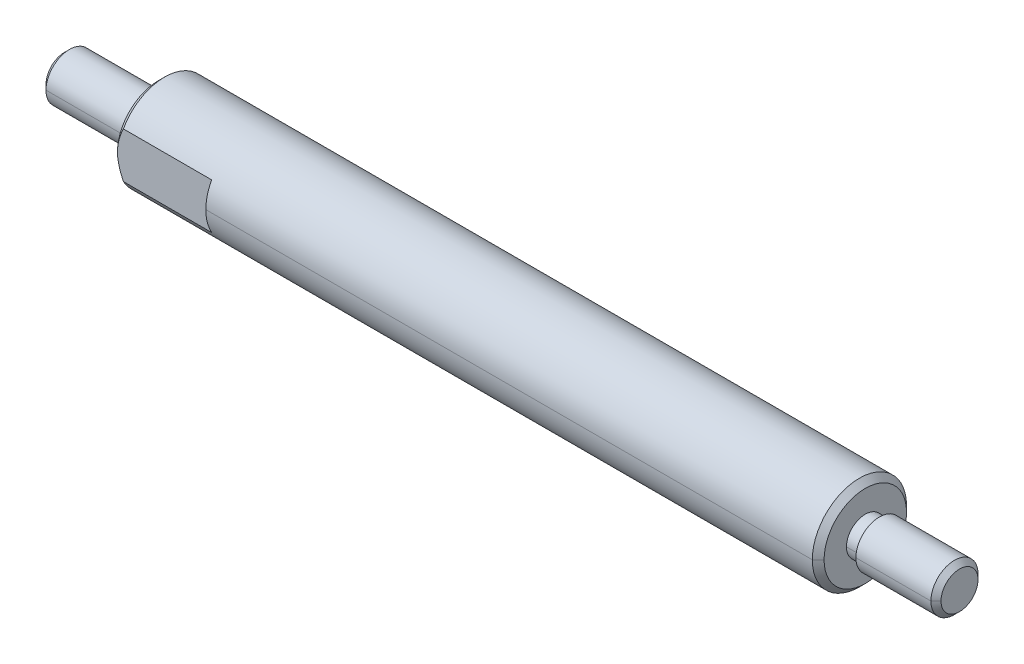
ISO-10303-21;
HEADER;
FILE_DESCRIPTION(('STEP AP214'),'2;1');
FILE_NAME('part.step','',(''),(''),'','','');
FILE_SCHEMA(('AUTOMOTIVE_DESIGN { 1 0 10303 214 1 1 1 1 }'));
ENDSEC;
DATA;
#1=APPLICATION_CONTEXT('core data for automotive mechanical design processes');
#2=APPLICATION_PROTOCOL_DEFINITION('international standard','automotive_design',2000,#1);
#3=PRODUCT_CONTEXT('',#1,'mechanical');
#4=PRODUCT('Part','Part','',(#3));
#5=PRODUCT_RELATED_PRODUCT_CATEGORY('part','',(#4));
#6=PRODUCT_DEFINITION_FORMATION('','',#4);
#7=PRODUCT_DEFINITION_CONTEXT('part definition',#1,'design');
#8=PRODUCT_DEFINITION('design','',#6,#7);
#9=PRODUCT_DEFINITION_SHAPE('','',#8);
#10=(LENGTH_UNIT() NAMED_UNIT(*) SI_UNIT(.MILLI.,.METRE.));
#11=(NAMED_UNIT(*) PLANE_ANGLE_UNIT() SI_UNIT($,.RADIAN.));
#12=(NAMED_UNIT(*) SI_UNIT($,.STERADIAN.) SOLID_ANGLE_UNIT());
#13=UNCERTAINTY_MEASURE_WITH_UNIT(LENGTH_MEASURE(1.E-05),#10,'distance_accuracy_value','');
#14=(GEOMETRIC_REPRESENTATION_CONTEXT(3) GLOBAL_UNCERTAINTY_ASSIGNED_CONTEXT((#13)) GLOBAL_UNIT_ASSIGNED_CONTEXT((#10,
#11,#12)) REPRESENTATION_CONTEXT('',''));
#15=CARTESIAN_POINT('',(0.,0.,0.));
#16=DIRECTION('',(0.,0.,1.));
#17=DIRECTION('',(1.,0.,0.));
#18=AXIS2_PLACEMENT_3D('',#15,#16,#17);
#19=CARTESIAN_POINT('',(0.,0.,0.));
#20=DIRECTION('',(1.,0.,0.));
#21=DIRECTION('',(0.,1.,0.));
#22=AXIS2_PLACEMENT_3D('',#19,#20,#21);
#23=CONICAL_SURFACE('',#22,3.5,0.785398163397448);
#24=CARTESIAN_POINT('',(0.5,0.,0.));
#25=DIRECTION('',(1.,0.,0.));
#26=DIRECTION('',(0.,0.,-1.));
#27=AXIS2_PLACEMENT_3D('',#24,#25,#26);
#28=CIRCLE('',#27,4.);
#29=CARTESIAN_POINT('',(0.5,-1.93649167310371,3.5));
#30=VERTEX_POINT('',#29);
#31=CARTESIAN_POINT('',(0.5,-1.93649167310371,-3.5));
#32=VERTEX_POINT('',#31);
#33=EDGE_CURVE('E11',#30,#32,#28,.T.);
#34=ORIENTED_EDGE('',*,*,#33,.F.);
#35=CARTESIAN_POINT('',(0.500000000000001,-1.93649167310371,3.5));
#36=CARTESIAN_POINT('',(0.481729894212885,-1.89874822282279,3.50000263641592));
#37=CARTESIAN_POINT('',(0.463809391218073,-1.86083494279448,3.50003144984892));
#38=CARTESIAN_POINT('',(0.428586511491032,-1.78442732561673,3.50010970070772));
#39=CARTESIAN_POINT('',(0.411288837618172,-1.74593082118933,3.50015926925334));
#40=CARTESIAN_POINT('',(0.377404980850407,-1.66846064543187,3.50024659944888));
#41=CARTESIAN_POINT('',(0.3608215799416,-1.62948575606787,3.50028431800336));
#42=CARTESIAN_POINT('',(0.328462664813169,-1.55115235623506,3.50033232603049));
#43=CARTESIAN_POINT('',(0.312688042674488,-1.51179347683754,3.50034258582854));
#44=CARTESIAN_POINT('',(0.282042244040601,-1.4327756106038,3.50033174018014));
#45=CARTESIAN_POINT('',(0.267170078584431,-1.3931170078691,3.5003106697376));
#46=CARTESIAN_POINT('',(0.238425065228237,-1.3135718201573,3.50024602692636));
#47=CARTESIAN_POINT('',(0.224549380422823,-1.27368626217215,3.50020252157718));
#48=CARTESIAN_POINT('',(0.197892794870912,-1.19374729444133,3.50011315115411));
#49=CARTESIAN_POINT('',(0.185107299963627,-1.15369541993336,3.50006729743444));
#50=CARTESIAN_POINT('',(0.16072263153736,-1.0734537181225,3.5000058547852));
#51=CARTESIAN_POINT('',(0.149117749799592,-1.03326563123095,3.49999011296507));
#52=CARTESIAN_POINT('',(0.127119094234048,-0.952520739957388,3.50002953689601));
#53=CARTESIAN_POINT('',(0.116726397725898,-0.911963641606916,3.50008476520527));
#54=CARTESIAN_POINT('',(0.0971615752584517,-0.830472191873705,3.50020787581652));
#55=CARTESIAN_POINT('',(0.087991876181674,-0.789537257807542,3.5002757826553));
#56=CARTESIAN_POINT('',(0.0709257689616744,-0.707371736995964,3.50039313623367));
#57=CARTESIAN_POINT('',(0.0630302803268335,-0.666140958972079,3.50044256967586));
#58=CARTESIAN_POINT('',(0.0485626549048874,-0.58345768936206,3.50050431589652));
#59=CARTESIAN_POINT('',(0.0419902001700179,-0.542005253508157,3.50051663760354));
#60=CARTESIAN_POINT('',(0.0302190934883362,-0.458943722261909,3.50050082008597));
#61=CARTESIAN_POINT('',(0.0250191980873555,-0.417334803541163,3.50047271763308));
#62=CARTESIAN_POINT('',(0.016043137784126,-0.334016964924032,3.50038646819118));
#63=CARTESIAN_POINT('',(0.0122651640142564,-0.292308240471382,3.50032835959872));
#64=CARTESIAN_POINT('',(0.00618267094413711,-0.208838599859571,3.50020461032438));
#65=CARTESIAN_POINT('',(0.0038761918883057,-0.167077827646641,3.50013897979839));
#66=CARTESIAN_POINT('',(0.000785517580601297,-0.0835453867620833,3.50003770804549));
#67=CARTESIAN_POINT('',(-3.16829512312464E-07,-0.0417737784206981,3.50000203455032));
#68=CARTESIAN_POINT('',(0.,0.,3.5));
#69=B_SPLINE_CURVE_WITH_KNOTS('',3,(#35,#36,#37,#38,#39,#40,#41,#42,#43,#44,#45,#46,#47,#48,#49,
#50,#51,#52,#53,#54,#55,#56,#57,#58,#59,#60,#61,#62,#63,#64,#65,#66,#67,#68),.UNSPECIFIED.,.F.,
.F.,(4,2,2,2,2,2,2,2,2,2,2,2,2,2,2,2,4),(0.,0.125797578323402,0.252402164550876,
0.379461988243441,0.506659069743281,0.633714146233809,0.760391852670917,0.886506215657117,
1.01197852628416,1.13756151314057,1.26339010892735,1.38930910425219,1.51519780285922,
1.64097205956828,1.76658577002032,1.89203183534899,2.01734260230366),.UNSPECIFIED.);
#70=CARTESIAN_POINT('',(0.,0.,3.5));
#71=VERTEX_POINT('',#70);
#72=EDGE_CURVE('E25',#30,#71,#69,.T.);
#73=ORIENTED_EDGE('',*,*,#72,.T.);
#74=CARTESIAN_POINT('',(0.,0.,0.));
#75=DIRECTION('',(1.,0.,0.));
#76=DIRECTION('',(0.,0.,-1.));
#77=AXIS2_PLACEMENT_3D('',#74,#75,#76);
#78=CIRCLE('',#77,3.5);
#79=CARTESIAN_POINT('',(0.,0.,-3.5));
#80=VERTEX_POINT('',#79);
#81=EDGE_CURVE('E502',#71,#80,#78,.T.);
#82=ORIENTED_EDGE('',*,*,#81,.T.);
#83=CARTESIAN_POINT('',(0.,0.,-3.5));
#84=CARTESIAN_POINT('',(-3.16829512398149E-07,-0.041773778420689,-3.50000203455032));
#85=CARTESIAN_POINT('',(0.00078551758060121,-0.0835453867620763,-3.5000377080455));
#86=CARTESIAN_POINT('',(0.00387619188830569,-0.167077827646636,-3.5001389797984));
#87=CARTESIAN_POINT('',(0.00618267094413709,-0.208838599859566,-3.50020461032438));
#88=CARTESIAN_POINT('',(0.0122651640142564,-0.292308240471378,-3.50032835959872));
#89=CARTESIAN_POINT('',(0.016043137784126,-0.334016964924027,-3.50038646819118));
#90=CARTESIAN_POINT('',(0.0250191980873555,-0.417334803541158,-3.50047271763308));
#91=CARTESIAN_POINT('',(0.0302190934883362,-0.458943722261905,-3.50050082008597));
#92=CARTESIAN_POINT('',(0.0419902001700178,-0.542005253508155,-3.50051663760354));
#93=CARTESIAN_POINT('',(0.0485626549048872,-0.583457689362059,-3.50050431589652));
#94=CARTESIAN_POINT('',(0.0630302803268333,-0.666140958972079,-3.50044256967586));
#95=CARTESIAN_POINT('',(0.0709257689616743,-0.707371736995963,-3.50039313623367));
#96=CARTESIAN_POINT('',(0.0879918761816741,-0.789537257807541,-3.5002757826553));
#97=CARTESIAN_POINT('',(0.0971615752584519,-0.830472191873704,-3.50020787581652));
#98=CARTESIAN_POINT('',(0.116726397725898,-0.911963641606916,-3.50008476520527));
#99=CARTESIAN_POINT('',(0.127119094234048,-0.952520739957389,-3.50002953689601));
#100=CARTESIAN_POINT('',(0.149117749799592,-1.03326563123096,-3.49999011296506));
#101=CARTESIAN_POINT('',(0.160722631537359,-1.07345371812251,-3.5000058547852));
#102=CARTESIAN_POINT('',(0.185107299963627,-1.15369541993336,-3.50006729743444));
#103=CARTESIAN_POINT('',(0.197892794870912,-1.19374729444133,-3.50011315115411));
#104=CARTESIAN_POINT('',(0.224549380422823,-1.27368626217215,-3.50020252157718));
#105=CARTESIAN_POINT('',(0.238425065228237,-1.3135718201573,-3.50024602692636));
#106=CARTESIAN_POINT('',(0.26717007858443,-1.3931170078691,-3.5003106697376));
#107=CARTESIAN_POINT('',(0.282042244040601,-1.4327756106038,-3.50033174018014));
#108=CARTESIAN_POINT('',(0.312688042674488,-1.51179347683754,-3.50034258582854));
#109=CARTESIAN_POINT('',(0.328462664813168,-1.55115235623507,-3.50033232603049));
#110=CARTESIAN_POINT('',(0.3608215799416,-1.62948575606788,-3.50028431800336));
#111=CARTESIAN_POINT('',(0.377404980850406,-1.66846064543188,-3.50024659944888));
#112=CARTESIAN_POINT('',(0.411288837618171,-1.74593082118933,-3.50015926925334));
#113=CARTESIAN_POINT('',(0.428586511491031,-1.78442732561673,-3.50010970070772));
#114=CARTESIAN_POINT('',(0.463809391218072,-1.86083494279448,-3.50003144984892));
#115=CARTESIAN_POINT('',(0.481729894212885,-1.89874822282279,-3.50000263641592));
#116=CARTESIAN_POINT('',(0.5,-1.93649167310371,-3.5));
#117=B_SPLINE_CURVE_WITH_KNOTS('',3,(#83,#84,#85,#86,#87,#88,#89,#90,#91,#92,#93,#94,#95,#96,
#97,#98,#99,#100,#101,#102,#103,#104,#105,#106,#107,#108,#109,#110,#111,#112,#113,#114,#115,
#116),.UNSPECIFIED.,.F.,.F.,(4,2,2,2,2,2,2,2,2,2,2,2,2,2,2,2,4),(0.,0.125310766954671,
0.250756832283348,0.376370542735383,0.502144799444446,0.628033498051478,0.753952493376318,
0.8797810891631,1.00536407601951,1.13083638664656,1.25695074963275,1.38362845606987,
1.51068353256039,1.63788061406023,1.7649404377528,1.89154502398027,2.01734260230367),.UNSPECIFIED.);
#118=EDGE_CURVE('E492',#80,#32,#117,.T.);
#119=ORIENTED_EDGE('',*,*,#118,.T.);
#120=EDGE_LOOP('',(#34,#73,#82,#119));
#121=FACE_BOUND('',#120,.T.);
#122=ADVANCED_FACE('F16',(#121),#23,.T.);
#123=CARTESIAN_POINT('',(8.,-8.,-3.5));
#124=DIRECTION('',(0.,0.,1.));
#125=DIRECTION('',(1.,0.,0.));
#126=AXIS2_PLACEMENT_3D('',#123,#124,#125);
#127=PLANE('',#126);
#128=ORIENTED_EDGE('',*,*,#118,.F.);
#129=CARTESIAN_POINT('',(0.500000000000001,1.93649167310371,-3.5));
#130=CARTESIAN_POINT('',(0.490875249697932,1.91764327784195,-3.50000021533807));
#131=CARTESIAN_POINT('',(0.481836693213126,1.89875312507498,-3.50000547341037));
#132=CARTESIAN_POINT('',(0.463900454733611,1.86081602096756,-3.50002157401013));
#133=CARTESIAN_POINT('',(0.455003458380112,1.84176874548831,-3.5000324382043));
#134=CARTESIAN_POINT('',(0.437364302847882,1.80353532796564,-3.50005521074573));
#135=CARTESIAN_POINT('',(0.428622669981429,1.78434894306122,-3.50006712204136));
#136=CARTESIAN_POINT('',(0.41130844219508,1.74585451619488,-3.50008883201298));
#137=CARTESIAN_POINT('',(0.402736214787635,1.72654630889734,-3.50009862647471));
#138=CARTESIAN_POINT('',(0.385774935331718,1.68782480496335,-3.50011392977831));
#139=CARTESIAN_POINT('',(0.377386090428912,1.66841141756619,-3.50011943399487));
#140=CARTESIAN_POINT('',(0.360805733571367,1.62949541041907,-3.50012508023241));
#141=CARTESIAN_POINT('',(0.352614266092422,1.60999277171432,-3.50012522105592));
#142=CARTESIAN_POINT('',(0.336442816919582,1.57091338104565,-3.50012012273438));
#143=CARTESIAN_POINT('',(0.328462713973172,1.55133667927397,-3.50011488674552));
#144=CARTESIAN_POINT('',(0.312728162869376,1.51212349994854,-3.50010009189973));
#145=CARTESIAN_POINT('',(0.304973424172466,1.49248713901867,-3.50009053889776));
#146=CARTESIAN_POINT('',(0.289703731976782,1.45316818008757,-3.50006916274861));
#147=CARTESIAN_POINT('',(0.282188314961646,1.43348576217604,-3.5000573443459));
#148=CARTESIAN_POINT('',(0.267411557963523,1.39408732702519,-3.50003470283807));
#149=CARTESIAN_POINT('',(0.260149577440294,1.3743715501423,-3.50002387709109));
#150=CARTESIAN_POINT('',(0.245893404676809,1.3349183508543,-3.50000680037563));
#151=CARTESIAN_POINT('',(0.238898393504929,1.31518122457,-3.5000005341345));
#152=CARTESIAN_POINT('',(0.225174780756556,1.27564590082737,-3.49999969142382));
#153=CARTESIAN_POINT('',(0.218445815174127,1.25584782979736,-3.50000509837647));
#154=CARTESIAN_POINT('',(0.205240545078235,1.21613203270299,-3.5000259541039));
#155=CARTESIAN_POINT('',(0.198764666753273,1.19621416491386,-3.50004141910367));
#156=CARTESIAN_POINT('',(0.186073389102022,1.15626734244253,-3.50007742769901));
#157=CARTESIAN_POINT('',(0.179858336174558,1.13623827768881,-3.50009797781304));
#158=CARTESIAN_POINT('',(0.167697599963074,1.09607712199876,-3.5001410317733));
#159=CARTESIAN_POINT('',(0.161752186178359,1.07594494943509,-3.50016353751138));
#160=CARTESIAN_POINT('',(0.150139363252317,1.03558508778073,-3.50020780497892));
#161=CARTESIAN_POINT('',(0.144472154349511,1.01535734105509,-3.50022956616917));
#162=CARTESIAN_POINT('',(0.133424433756914,0.974813168238372,-3.50027042248861));
#163=CARTESIAN_POINT('',(0.128044061983838,0.954496704005716,-3.50028951632391));
#164=CARTESIAN_POINT('',(0.117578686460978,0.913781272961122,-3.50032377206706));
#165=CARTESIAN_POINT('',(0.112493772298314,0.893382283110983,-3.50033893278711));
#166=CARTESIAN_POINT('',(0.102627958452014,0.85250730037319,-3.50036468555281));
#167=CARTESIAN_POINT('',(0.097847109304972,0.832031295281214,-3.5003752768407));
#168=CARTESIAN_POINT('',(0.0885981303417215,0.791007076727367,-3.50039194007419));
#169=CARTESIAN_POINT('',(0.0841300247315237,0.770458857805206,-3.50039801167032));
#170=CARTESIAN_POINT('',(0.0755149595619078,0.72929435419023,-3.50040598531661));
#171=CARTESIAN_POINT('',(0.0713680121392101,0.708678066955748,-3.50040788720927));
#172=CARTESIAN_POINT('',(0.0634048724470851,0.667381736677047,-3.50040946017625));
#173=CARTESIAN_POINT('',(0.0595886791314459,0.646701693834709,-3.50040913125763));
#174=CARTESIAN_POINT('',(0.0522952076236296,0.605286370081193,-3.500406414557));
#175=CARTESIAN_POINT('',(0.0488178586197354,0.584551101645589,-3.50040402720619));
#176=CARTESIAN_POINT('',(0.0422069311616563,0.543034337109382,-3.50039475919438));
#177=CARTESIAN_POINT('',(0.039073215475684,0.522252862869072,-3.50038788033476));
#178=CARTESIAN_POINT('',(0.0331552081933573,0.480652002202429,-3.50036898648347));
#179=CARTESIAN_POINT('',(0.0303707229708554,0.459832643335171,-3.50035697435429));
#180=CARTESIAN_POINT('',(0.0251566001863169,0.41816387174196,-3.50032784411369));
#181=CARTESIAN_POINT('',(0.0227267229464012,0.397314489024491,-3.50031072947506));
#182=CARTESIAN_POINT('',(0.0182272952882025,0.355593025326963,-3.50027237209467));
#183=CARTESIAN_POINT('',(0.0161574700050198,0.334720974010234,-3.50025113252835));
#184=CARTESIAN_POINT('',(0.0123835708281206,0.29296104914705,-3.50020631257991));
#185=CARTESIAN_POINT('',(0.0106791985139428,0.272073202594836,-3.50018273413085));
#186=CARTESIAN_POINT('',(0.00764172620233359,0.230288087106283,-3.50013595413175));
#187=CARTESIAN_POINT('',(0.00630831644050704,0.209390840714381,-3.50011275228258));
#188=CARTESIAN_POINT('',(0.00401788904623468,0.167592875232936,-3.50006987287111));
#189=CARTESIAN_POINT('',(0.00306056362229496,0.146692173047007,-3.50005019243407));
#190=CARTESIAN_POINT('',(0.00152885609777019,0.104892763671267,-3.5000196614215));
#191=CARTESIAN_POINT('',(0.000954180702697819,0.083994067257996,-3.5000088040818));
#192=CARTESIAN_POINT('',(0.000186358423632153,0.0420636069512591,-3.4999967909775));
#193=CARTESIAN_POINT('',(-4.46698193477926E-06,0.0210318005458209,-3.49999569410731));
#194=CARTESIAN_POINT('',(0.,0.,-3.5));
#195=B_SPLINE_CURVE_WITH_KNOTS('',3,(#129,#130,#131,#132,#133,#134,#135,#136,#137,#138,#139,
#140,#141,#142,#143,#144,#145,#146,#147,#148,#149,#150,#151,#152,#153,#154,#155,#156,#157,#158,
#159,#160,#161,#162,#163,#164,#165,#166,#167,#168,#169,#170,#171,#172,#173,#174,#175,#176,#177,
#178,#179,#180,#181,#182,#183,#184,#185,#186,#187,#188,#189,#190,#191,#192,#193,#194),
.UNSPECIFIED.,.F.,.F.,(4,2,2,2,2,2,2,2,2,2,2,2,2,2,2,2,2,2,2,2,2,2,2,2,2,2,2,2,2,2,2,2,4),(0.,
0.0628226479739315,0.12588993393465,0.189140866391467,0.252516584166299,0.315960533270773,
0.379418647217314,0.442839532348226,0.506174659666208,0.569378564546006,0.632409055589583,
0.695227433744642,0.757956658454826,0.820787325784938,0.883698955003026,0.946672136642775,
1.00968999805434,1.07273832294561,1.1358056663178,1.19888346444212,1.26196613933325,
1.3250511969865,1.38813605508745,1.45120770130703,1.51425406708742,1.57726532166237,
1.64023378799151,1.7031539709805,1.76602257746556,1.8288385282014,1.89160296204646,
1.95431923251298,2.01741367656724),.UNSPECIFIED.);
#196=CARTESIAN_POINT('',(0.5,1.93649167310371,-3.5));
#197=VERTEX_POINT('',#196);
#198=EDGE_CURVE('E252',#197,#80,#195,.T.);
#199=ORIENTED_EDGE('',*,*,#198,.F.);
#200=DIRECTION('',(-1.,0.,0.));
#201=VECTOR('',#200,1.);
#202=CARTESIAN_POINT('',(60.,1.93649167310371,-3.5));
#203=LINE('',#202,#201);
#204=CARTESIAN_POINT('',(8.,1.93649167310371,-3.5));
#205=VERTEX_POINT('',#204);
#206=EDGE_CURVE('E457',#205,#197,#203,.T.);
#207=ORIENTED_EDGE('',*,*,#206,.F.);
#208=DIRECTION('',(0.,1.,0.));
#209=VECTOR('',#208,1.);
#210=CARTESIAN_POINT('',(8.,-8.,-3.5));
#211=LINE('',#210,#209);
#212=CARTESIAN_POINT('',(8.,-1.93649167310371,-3.5));
#213=VERTEX_POINT('',#212);
#214=EDGE_CURVE('E452',#213,#205,#211,.T.);
#215=ORIENTED_EDGE('',*,*,#214,.F.);
#216=DIRECTION('',(1.,0.,0.));
#217=VECTOR('',#216,1.);
#218=CARTESIAN_POINT('',(60.,-1.93649167310371,-3.5));
#219=LINE('',#218,#217);
#220=EDGE_CURVE('E447',#32,#213,#219,.T.);
#221=ORIENTED_EDGE('',*,*,#220,.F.);
#222=EDGE_LOOP('',(#128,#199,#207,#215,#221));
#223=FACE_BOUND('',#222,.T.);
#224=ADVANCED_FACE('F468',(#223),#127,.F.);
#225=CARTESIAN_POINT('',(60.,0.,0.));
#226=DIRECTION('',(1.,0.,0.));
#227=DIRECTION('',(0.,1.,-5.8935951136395E-10));
#228=AXIS2_PLACEMENT_3D('',#225,#226,#227);
#229=CYLINDRICAL_SURFACE('',#228,4.);
#230=DIRECTION('',(1.,0.,0.));
#231=VECTOR('',#230,1.);
#232=CARTESIAN_POINT('',(8.,0.,4.));
#233=LINE('',#232,#231);
#234=CARTESIAN_POINT('',(8.,0.,4.));
#235=VERTEX_POINT('',#234);
#236=CARTESIAN_POINT('',(59.5,0.,4.));
#237=VERTEX_POINT('',#236);
#238=EDGE_CURVE('E442',#235,#237,#233,.T.);
#239=ORIENTED_EDGE('',*,*,#238,.F.);
#240=CARTESIAN_POINT('',(8.,0.,0.));
#241=DIRECTION('',(1.,0.,0.));
#242=DIRECTION('',(0.,0.,-1.));
#243=AXIS2_PLACEMENT_3D('',#240,#241,#242);
#244=CIRCLE('',#243,4.);
#245=CARTESIAN_POINT('',(8.,-1.93649167310371,3.5));
#246=VERTEX_POINT('',#245);
#247=EDGE_CURVE('E438',#235,#246,#244,.T.);
#248=ORIENTED_EDGE('',*,*,#247,.T.);
#249=DIRECTION('',(-1.,0.,0.));
#250=VECTOR('',#249,1.);
#251=CARTESIAN_POINT('',(60.,-1.93649167310371,3.5));
#252=LINE('',#251,#250);
#253=EDGE_CURVE('E433',#246,#30,#252,.T.);
#254=ORIENTED_EDGE('',*,*,#253,.T.);
#255=ORIENTED_EDGE('',*,*,#33,.T.);
#256=ORIENTED_EDGE('',*,*,#220,.T.);
#257=CARTESIAN_POINT('',(8.,0.,0.));
#258=DIRECTION('',(1.,0.,0.));
#259=DIRECTION('',(0.,0.,-1.));
#260=AXIS2_PLACEMENT_3D('',#257,#258,#259);
#261=CIRCLE('',#260,4.);
#262=CARTESIAN_POINT('',(8.,0.,-4.));
#263=VERTEX_POINT('',#262);
#264=EDGE_CURVE('E429',#213,#263,#261,.T.);
#265=ORIENTED_EDGE('',*,*,#264,.T.);
#266=DIRECTION('',(1.,0.,0.));
#267=VECTOR('',#266,1.);
#268=CARTESIAN_POINT('',(8.00000000000001,0.,-4.));
#269=LINE('',#268,#267);
#270=CARTESIAN_POINT('',(59.5,0.,-4.));
#271=VERTEX_POINT('',#270);
#272=EDGE_CURVE('E425',#263,#271,#269,.T.);
#273=ORIENTED_EDGE('',*,*,#272,.T.);
#274=CARTESIAN_POINT('',(59.5,0.,0.));
#275=DIRECTION('',(1.,0.,0.));
#276=DIRECTION('',(0.,0.,-1.));
#277=AXIS2_PLACEMENT_3D('',#274,#275,#276);
#278=CIRCLE('',#277,4.);
#279=EDGE_CURVE('E420',#237,#271,#278,.T.);
#280=ORIENTED_EDGE('',*,*,#279,.F.);
#281=EDGE_LOOP('',(#239,#248,#254,#255,#256,#265,#273,#280));
#282=FACE_BOUND('',#281,.T.);
#283=ADVANCED_FACE('F477',(#282),#229,.T.);
#284=CARTESIAN_POINT('',(59.5,0.,0.));
#285=DIRECTION('',(-1.,0.,0.));
#286=DIRECTION('',(0.,1.,0.));
#287=AXIS2_PLACEMENT_3D('',#284,#285,#286);
#288=CONICAL_SURFACE('',#287,4.,0.785398163397448);
#289=DIRECTION('',(-0.707106781186548,0.,-0.707106781186547));
#290=VECTOR('',#289,1.);
#291=CARTESIAN_POINT('',(60.,0.,-3.5));
#292=LINE('',#291,#290);
#293=CARTESIAN_POINT('',(60.,0.,-3.5));
#294=VERTEX_POINT('',#293);
#295=EDGE_CURVE('E415',#294,#271,#292,.T.);
#296=ORIENTED_EDGE('',*,*,#295,.F.);
#297=CARTESIAN_POINT('',(60.,0.,0.));
#298=DIRECTION('',(1.,0.,0.));
#299=DIRECTION('',(0.,0.,-1.));
#300=AXIS2_PLACEMENT_3D('',#297,#298,#299);
#301=CIRCLE('',#300,3.5);
#302=CARTESIAN_POINT('',(60.,0.,3.5));
#303=VERTEX_POINT('',#302);
#304=EDGE_CURVE('E410',#303,#294,#301,.T.);
#305=ORIENTED_EDGE('',*,*,#304,.F.);
#306=DIRECTION('',(-0.707106781186548,0.,0.707106781186547));
#307=VECTOR('',#306,1.);
#308=CARTESIAN_POINT('',(60.,0.,3.5));
#309=LINE('',#308,#307);
#310=EDGE_CURVE('E405',#303,#237,#309,.T.);
#311=ORIENTED_EDGE('',*,*,#310,.T.);
#312=ORIENTED_EDGE('',*,*,#279,.T.);
#313=EDGE_LOOP('',(#296,#305,#311,#312));
#314=FACE_BOUND('',#313,.T.);
#315=ADVANCED_FACE('F533',(#314),#288,.T.);
#316=CARTESIAN_POINT('',(59.5,0.,0.));
#317=DIRECTION('',(-1.,0.,0.));
#318=DIRECTION('',(0.,-1.,0.));
#319=AXIS2_PLACEMENT_3D('',#316,#317,#318);
#320=CONICAL_SURFACE('',#319,4.,0.785398163397448);
#321=ORIENTED_EDGE('',*,*,#295,.T.);
#322=CARTESIAN_POINT('',(59.5,0.,0.));
#323=DIRECTION('',(1.,0.,0.));
#324=DIRECTION('',(0.,0.,-1.));
#325=AXIS2_PLACEMENT_3D('',#322,#323,#324);
#326=CIRCLE('',#325,4.);
#327=EDGE_CURVE('E400',#271,#237,#326,.T.);
#328=ORIENTED_EDGE('',*,*,#327,.T.);
#329=ORIENTED_EDGE('',*,*,#310,.F.);
#330=CARTESIAN_POINT('',(60.,0.,0.));
#331=DIRECTION('',(1.,0.,0.));
#332=DIRECTION('',(0.,0.,-1.));
#333=AXIS2_PLACEMENT_3D('',#330,#331,#332);
#334=CIRCLE('',#333,3.5);
#335=EDGE_CURVE('E395',#294,#303,#334,.T.);
#336=ORIENTED_EDGE('',*,*,#335,.F.);
#337=EDGE_LOOP('',(#321,#328,#329,#336));
#338=FACE_BOUND('',#337,.T.);
#339=ADVANCED_FACE('F540',(#338),#320,.T.);
#340=CARTESIAN_POINT('',(60.,3.5,0.));
#341=DIRECTION('',(-1.,0.,0.));
#342=DIRECTION('',(0.,0.,1.));
#343=AXIS2_PLACEMENT_3D('',#340,#341,#342);
#344=PLANE('',#343);
#345=CARTESIAN_POINT('',(60.,0.,0.));
#346=DIRECTION('',(1.,0.,0.));
#347=DIRECTION('',(0.,0.,-1.));
#348=AXIS2_PLACEMENT_3D('',#345,#346,#347);
#349=CIRCLE('',#348,1.6);
#350=CARTESIAN_POINT('',(60.,0.,1.6));
#351=VERTEX_POINT('',#350);
#352=CARTESIAN_POINT('',(60.,0.,-1.6));
#353=VERTEX_POINT('',#352);
#354=EDGE_CURVE('E390',#351,#353,#349,.T.);
#355=ORIENTED_EDGE('',*,*,#354,.F.);
#356=CARTESIAN_POINT('',(60.,0.,0.));
#357=DIRECTION('',(1.,0.,0.));
#358=DIRECTION('',(0.,0.,-1.));
#359=AXIS2_PLACEMENT_3D('',#356,#357,#358);
#360=CIRCLE('',#359,1.6);
#361=EDGE_CURVE('E385',#353,#351,#360,.T.);
#362=ORIENTED_EDGE('',*,*,#361,.F.);
#363=EDGE_LOOP('',(#355,#362));
#364=FACE_BOUND('',#363,.T.);
#365=ORIENTED_EDGE('',*,*,#335,.T.);
#366=ORIENTED_EDGE('',*,*,#304,.T.);
#367=EDGE_LOOP('',(#365,#366));
#368=FACE_BOUND('',#367,.T.);
#369=ADVANCED_FACE('F547',(#364,#368),#344,.F.);
#370=CARTESIAN_POINT('',(68.,0.,0.));
#371=DIRECTION('',(1.,0.,0.));
#372=DIRECTION('',(0.,-1.,0.));
#373=AXIS2_PLACEMENT_3D('',#370,#371,#372);
#374=CYLINDRICAL_SURFACE('',#373,1.6);
#375=DIRECTION('',(1.,0.,0.));
#376=VECTOR('',#375,1.);
#377=CARTESIAN_POINT('',(60.,0.,1.6));
#378=LINE('',#377,#376);
#379=CARTESIAN_POINT('',(61.2,0.,1.6));
#380=VERTEX_POINT('',#379);
#381=EDGE_CURVE('E381',#351,#380,#378,.T.);
#382=ORIENTED_EDGE('',*,*,#381,.T.);
#383=CARTESIAN_POINT('',(61.2,0.,0.));
#384=DIRECTION('',(1.,0.,0.));
#385=DIRECTION('',(0.,0.,-1.));
#386=AXIS2_PLACEMENT_3D('',#383,#384,#385);
#387=CIRCLE('',#386,1.6);
#388=CARTESIAN_POINT('',(61.2,0.,-1.6));
#389=VERTEX_POINT('',#388);
#390=EDGE_CURVE('E376',#389,#380,#387,.T.);
#391=ORIENTED_EDGE('',*,*,#390,.F.);
#392=DIRECTION('',(1.,0.,0.));
#393=VECTOR('',#392,1.);
#394=CARTESIAN_POINT('',(60.,0.,-1.6));
#395=LINE('',#394,#393);
#396=EDGE_CURVE('E371',#353,#389,#395,.T.);
#397=ORIENTED_EDGE('',*,*,#396,.F.);
#398=ORIENTED_EDGE('',*,*,#361,.T.);
#399=EDGE_LOOP('',(#382,#391,#397,#398));
#400=FACE_BOUND('',#399,.T.);
#401=ADVANCED_FACE('F555',(#400),#374,.T.);
#402=CARTESIAN_POINT('',(68.,0.,0.));
#403=DIRECTION('',(1.,0.,0.));
#404=DIRECTION('',(0.,1.,0.));
#405=AXIS2_PLACEMENT_3D('',#402,#403,#404);
#406=CYLINDRICAL_SURFACE('',#405,1.6);
#407=ORIENTED_EDGE('',*,*,#381,.F.);
#408=ORIENTED_EDGE('',*,*,#354,.T.);
#409=ORIENTED_EDGE('',*,*,#396,.T.);
#410=CARTESIAN_POINT('',(61.2,0.,0.));
#411=DIRECTION('',(1.,0.,0.));
#412=DIRECTION('',(0.,0.,-1.));
#413=AXIS2_PLACEMENT_3D('',#410,#411,#412);
#414=CIRCLE('',#413,1.6);
#415=EDGE_CURVE('E366',#380,#389,#414,.T.);
#416=ORIENTED_EDGE('',*,*,#415,.F.);
#417=EDGE_LOOP('',(#407,#408,#409,#416));
#418=FACE_BOUND('',#417,.T.);
#419=ADVANCED_FACE('F563',(#418),#406,.T.);
#420=CARTESIAN_POINT('',(61.2,1.6,0.));
#421=DIRECTION('',(1.,0.,0.));
#422=DIRECTION('',(0.,0.,-1.));
#423=AXIS2_PLACEMENT_3D('',#420,#421,#422);
#424=PLANE('',#423);
#425=CARTESIAN_POINT('',(61.2,0.,0.));
#426=DIRECTION('',(1.,0.,0.));
#427=DIRECTION('',(0.,0.,-1.));
#428=AXIS2_PLACEMENT_3D('',#425,#426,#427);
#429=CIRCLE('',#428,2.);
#430=CARTESIAN_POINT('',(61.2,0.,2.));
#431=VERTEX_POINT('',#430);
#432=CARTESIAN_POINT('',(61.2,0.,-2.));
#433=VERTEX_POINT('',#432);
#434=EDGE_CURVE('E361',#431,#433,#429,.T.);
#435=ORIENTED_EDGE('',*,*,#434,.F.);
#436=CARTESIAN_POINT('',(61.2,0.,0.));
#437=DIRECTION('',(1.,0.,0.));
#438=DIRECTION('',(0.,0.,-1.));
#439=AXIS2_PLACEMENT_3D('',#436,#437,#438);
#440=CIRCLE('',#439,2.);
#441=EDGE_CURVE('E356',#433,#431,#440,.T.);
#442=ORIENTED_EDGE('',*,*,#441,.F.);
#443=EDGE_LOOP('',(#435,#442));
#444=FACE_BOUND('',#443,.T.);
#445=ORIENTED_EDGE('',*,*,#390,.T.);
#446=ORIENTED_EDGE('',*,*,#415,.T.);
#447=EDGE_LOOP('',(#445,#446));
#448=FACE_BOUND('',#447,.T.);
#449=ADVANCED_FACE('F571',(#444,#448),#424,.F.);
#450=CARTESIAN_POINT('',(68.,0.,0.));
#451=DIRECTION('',(1.,0.,0.));
#452=DIRECTION('',(0.,-1.,0.));
#453=AXIS2_PLACEMENT_3D('',#450,#451,#452);
#454=CYLINDRICAL_SURFACE('',#453,2.);
#455=DIRECTION('',(1.,0.,0.));
#456=VECTOR('',#455,1.);
#457=CARTESIAN_POINT('',(61.2,0.,2.));
#458=LINE('',#457,#456);
#459=CARTESIAN_POINT('',(67.5705,0.,2.));
#460=VERTEX_POINT('',#459);
#461=EDGE_CURVE('E352',#431,#460,#458,.T.);
#462=ORIENTED_EDGE('',*,*,#461,.T.);
#463=CARTESIAN_POINT('',(67.5705,0.,0.));
#464=DIRECTION('',(1.,0.,0.));
#465=DIRECTION('',(0.,0.,-1.));
#466=AXIS2_PLACEMENT_3D('',#463,#464,#465);
#467=CIRCLE('',#466,2.);
#468=CARTESIAN_POINT('',(67.5705,0.,-2.));
#469=VERTEX_POINT('',#468);
#470=EDGE_CURVE('E347',#469,#460,#467,.T.);
#471=ORIENTED_EDGE('',*,*,#470,.F.);
#472=DIRECTION('',(1.,0.,0.));
#473=VECTOR('',#472,1.);
#474=CARTESIAN_POINT('',(61.2,0.,-2.));
#475=LINE('',#474,#473);
#476=EDGE_CURVE('E342',#433,#469,#475,.T.);
#477=ORIENTED_EDGE('',*,*,#476,.F.);
#478=ORIENTED_EDGE('',*,*,#441,.T.);
#479=EDGE_LOOP('',(#462,#471,#477,#478));
#480=FACE_BOUND('',#479,.T.);
#481=ADVANCED_FACE('F579',(#480),#454,.T.);
#482=CARTESIAN_POINT('',(68.,0.,0.));
#483=DIRECTION('',(1.,0.,0.));
#484=DIRECTION('',(0.,1.,0.));
#485=AXIS2_PLACEMENT_3D('',#482,#483,#484);
#486=CYLINDRICAL_SURFACE('',#485,2.);
#487=ORIENTED_EDGE('',*,*,#461,.F.);
#488=ORIENTED_EDGE('',*,*,#434,.T.);
#489=ORIENTED_EDGE('',*,*,#476,.T.);
#490=CARTESIAN_POINT('',(67.5705,0.,0.));
#491=DIRECTION('',(1.,0.,0.));
#492=DIRECTION('',(0.,0.,-1.));
#493=AXIS2_PLACEMENT_3D('',#490,#491,#492);
#494=CIRCLE('',#493,2.);
#495=EDGE_CURVE('E337',#460,#469,#494,.T.);
#496=ORIENTED_EDGE('',*,*,#495,.F.);
#497=EDGE_LOOP('',(#487,#488,#489,#496));
#498=FACE_BOUND('',#497,.T.);
#499=ADVANCED_FACE('F587',(#498),#486,.T.);
#500=CARTESIAN_POINT('',(67.5705,0.,0.));
#501=DIRECTION('',(-1.,0.,0.));
#502=DIRECTION('',(0.,1.,0.));
#503=AXIS2_PLACEMENT_3D('',#500,#501,#502);
#504=CONICAL_SURFACE('',#503,2.,0.785398163397434);
#505=DIRECTION('',(-0.70710678118656,0.,-0.707106781186535));
#506=VECTOR('',#505,1.);
#507=CARTESIAN_POINT('',(68.,0.,-1.57050000000001));
#508=LINE('',#507,#506);
#509=CARTESIAN_POINT('',(68.,0.,-1.5705));
#510=VERTEX_POINT('',#509);
#511=EDGE_CURVE('E332',#510,#469,#508,.T.);
#512=ORIENTED_EDGE('',*,*,#511,.F.);
#513=CARTESIAN_POINT('',(68.,0.,0.));
#514=DIRECTION('',(1.,0.,0.));
#515=DIRECTION('',(0.,0.,-1.));
#516=AXIS2_PLACEMENT_3D('',#513,#514,#515);
#517=CIRCLE('',#516,1.5705);
#518=CARTESIAN_POINT('',(68.,0.,1.57050000000001));
#519=VERTEX_POINT('',#518);
#520=EDGE_CURVE('E327',#519,#510,#517,.T.);
#521=ORIENTED_EDGE('',*,*,#520,.F.);
#522=DIRECTION('',(-0.70710678118656,0.,0.707106781186535));
#523=VECTOR('',#522,1.);
#524=CARTESIAN_POINT('',(68.,0.,1.57050000000001));
#525=LINE('',#524,#523);
#526=EDGE_CURVE('E322',#519,#460,#525,.T.);
#527=ORIENTED_EDGE('',*,*,#526,.T.);
#528=ORIENTED_EDGE('',*,*,#495,.T.);
#529=EDGE_LOOP('',(#512,#521,#527,#528));
#530=FACE_BOUND('',#529,.T.);
#531=ADVANCED_FACE('F595',(#530),#504,.T.);
#532=CARTESIAN_POINT('',(67.5705,0.,0.));
#533=DIRECTION('',(-1.,0.,0.));
#534=DIRECTION('',(0.,-1.,0.));
#535=AXIS2_PLACEMENT_3D('',#532,#533,#534);
#536=CONICAL_SURFACE('',#535,2.,0.785398163397434);
#537=ORIENTED_EDGE('',*,*,#511,.T.);
#538=ORIENTED_EDGE('',*,*,#470,.T.);
#539=ORIENTED_EDGE('',*,*,#526,.F.);
#540=CARTESIAN_POINT('',(68.,0.,0.));
#541=DIRECTION('',(1.,0.,0.));
#542=DIRECTION('',(0.,0.,-1.));
#543=AXIS2_PLACEMENT_3D('',#540,#541,#542);
#544=CIRCLE('',#543,1.5705);
#545=EDGE_CURVE('E317',#510,#519,#544,.T.);
#546=ORIENTED_EDGE('',*,*,#545,.F.);
#547=EDGE_LOOP('',(#537,#538,#539,#546));
#548=FACE_BOUND('',#547,.T.);
#549=ADVANCED_FACE('F603',(#548),#536,.T.);
#550=CARTESIAN_POINT('',(68.,1.5705,0.));
#551=DIRECTION('',(-1.,0.,0.));
#552=DIRECTION('',(0.,0.,1.));
#553=AXIS2_PLACEMENT_3D('',#550,#551,#552);
#554=PLANE('',#553);
#555=ORIENTED_EDGE('',*,*,#545,.T.);
#556=ORIENTED_EDGE('',*,*,#520,.T.);
#557=EDGE_LOOP('',(#555,#556));
#558=FACE_BOUND('',#557,.T.);
#559=ADVANCED_FACE('F611',(#558),#554,.F.);
#560=CARTESIAN_POINT('',(60.,0.,0.));
#561=DIRECTION('',(1.,0.,0.));
#562=DIRECTION('',(0.,-1.,0.));
#563=AXIS2_PLACEMENT_3D('',#560,#561,#562);
#564=CYLINDRICAL_SURFACE('',#563,4.);
#565=ORIENTED_EDGE('',*,*,#238,.T.);
#566=ORIENTED_EDGE('',*,*,#327,.F.);
#567=ORIENTED_EDGE('',*,*,#272,.F.);
#568=CARTESIAN_POINT('',(8.,0.,0.));
#569=DIRECTION('',(1.,0.,0.));
#570=DIRECTION('',(0.,0.,-1.));
#571=AXIS2_PLACEMENT_3D('',#568,#569,#570);
#572=CIRCLE('',#571,4.);
#573=EDGE_CURVE('E312',#263,#205,#572,.T.);
#574=ORIENTED_EDGE('',*,*,#573,.T.);
#575=ORIENTED_EDGE('',*,*,#206,.T.);
#576=CARTESIAN_POINT('',(0.5,0.,0.));
#577=DIRECTION('',(1.,0.,0.));
#578=DIRECTION('',(0.,0.,-1.));
#579=AXIS2_PLACEMENT_3D('',#576,#577,#578);
#580=CIRCLE('',#579,4.);
#581=CARTESIAN_POINT('',(0.5,1.93649167310371,3.5));
#582=VERTEX_POINT('',#581);
#583=EDGE_CURVE('E308',#197,#582,#580,.T.);
#584=ORIENTED_EDGE('',*,*,#583,.T.);
#585=DIRECTION('',(1.,0.,0.));
#586=VECTOR('',#585,1.);
#587=CARTESIAN_POINT('',(60.,1.93649167310371,3.5));
#588=LINE('',#587,#586);
#589=CARTESIAN_POINT('',(8.,1.93649167310371,3.5));
#590=VERTEX_POINT('',#589);
#591=EDGE_CURVE('E304',#582,#590,#588,.T.);
#592=ORIENTED_EDGE('',*,*,#591,.T.);
#593=CARTESIAN_POINT('',(8.,0.,0.));
#594=DIRECTION('',(1.,0.,0.));
#595=DIRECTION('',(0.,0.,-1.));
#596=AXIS2_PLACEMENT_3D('',#593,#594,#595);
#597=CIRCLE('',#596,4.);
#598=EDGE_CURVE('E299',#590,#235,#597,.T.);
#599=ORIENTED_EDGE('',*,*,#598,.T.);
#600=EDGE_LOOP('',(#565,#566,#567,#574,#575,#584,#592,#599));
#601=FACE_BOUND('',#600,.T.);
#602=ADVANCED_FACE('F619',(#601),#564,.T.);
#603=CARTESIAN_POINT('',(8.,0.,0.));
#604=DIRECTION('',(1.,0.,0.));
#605=DIRECTION('',(0.,0.,-1.));
#606=AXIS2_PLACEMENT_3D('',#603,#604,#605);
#607=PLANE('',#606);
#608=DIRECTION('',(0.,-1.,0.));
#609=VECTOR('',#608,1.);
#610=CARTESIAN_POINT('',(8.,8.,3.5));
#611=LINE('',#610,#609);
#612=EDGE_CURVE('E296',#590,#246,#611,.T.);
#613=ORIENTED_EDGE('',*,*,#612,.T.);
#614=ORIENTED_EDGE('',*,*,#247,.F.);
#615=ORIENTED_EDGE('',*,*,#598,.F.);
#616=EDGE_LOOP('',(#613,#614,#615));
#617=FACE_BOUND('',#616,.T.);
#618=ADVANCED_FACE('F283',(#617),#607,.F.);
#619=CARTESIAN_POINT('',(8.,8.,3.5));
#620=DIRECTION('',(0.,0.,-1.));
#621=DIRECTION('',(-1.,0.,0.));
#622=AXIS2_PLACEMENT_3D('',#619,#620,#621);
#623=PLANE('',#622);
#624=CARTESIAN_POINT('',(0.,0.,3.5));
#625=CARTESIAN_POINT('',(-4.46698193482508E-06,0.0210318005458208,3.49999569410731));
#626=CARTESIAN_POINT('',(0.000186358423632139,0.0420636069512585,3.4999967909775));
#627=CARTESIAN_POINT('',(0.000954180702697844,0.0839940672579948,3.5000088040818));
#628=CARTESIAN_POINT('',(0.00152885609777023,0.104892763671266,3.50001966142149));
#629=CARTESIAN_POINT('',(0.00306056362229488,0.146692173047006,3.50005019243407));
#630=CARTESIAN_POINT('',(0.00401788904623448,0.167592875232937,3.50006987287111));
#631=CARTESIAN_POINT('',(0.00630831644050688,0.209390840714382,3.50011275228258));
#632=CARTESIAN_POINT('',(0.00764172620233355,0.230288087106282,3.50013595413175));
#633=CARTESIAN_POINT('',(0.0106791985139426,0.272073202594835,3.50018273413085));
#634=CARTESIAN_POINT('',(0.0123835708281202,0.29296104914705,3.50020631257991));
#635=CARTESIAN_POINT('',(0.0161574700050193,0.334720974010235,3.50025113252835));
#636=CARTESIAN_POINT('',(0.018227295288202,0.355593025326963,3.50027237209467));
#637=CARTESIAN_POINT('',(0.0227267229464008,0.39731448902449,3.50031072947506));
#638=CARTESIAN_POINT('',(0.0251566001863165,0.418163871741958,3.50032784411369));
#639=CARTESIAN_POINT('',(0.0303707229708548,0.45983264333517,3.50035697435429));
#640=CARTESIAN_POINT('',(0.0331552081933564,0.48065200220243,3.50036898648347));
#641=CARTESIAN_POINT('',(0.0390732154756831,0.522252862869073,3.50038788033476));
#642=CARTESIAN_POINT('',(0.0422069311616555,0.543034337109381,3.50039475919438));
#643=CARTESIAN_POINT('',(0.0488178586197348,0.584551101645586,3.50040402720619));
#644=CARTESIAN_POINT('',(0.0522952076236289,0.60528637008119,3.500406414557));
#645=CARTESIAN_POINT('',(0.0595886791314451,0.646701693834707,3.50040913125762));
#646=CARTESIAN_POINT('',(0.0634048724470841,0.667381736677047,3.50040946017625));
#647=CARTESIAN_POINT('',(0.0713680121392091,0.70867806695575,3.50040788720927));
#648=CARTESIAN_POINT('',(0.0755149595619068,0.729294354190233,3.50040598531661));
#649=CARTESIAN_POINT('',(0.0841300247315227,0.770458857805209,3.50039801167032));
#650=CARTESIAN_POINT('',(0.0885981303417206,0.791007076727369,3.50039194007419));
#651=CARTESIAN_POINT('',(0.0978471093049712,0.832031295281214,3.5003752768407));
#652=CARTESIAN_POINT('',(0.102627958452014,0.85250730037319,3.50036468555281));
#653=CARTESIAN_POINT('',(0.112493772298314,0.893382283110982,3.50033893278711));
#654=CARTESIAN_POINT('',(0.117578686460978,0.913781272961121,3.50032377206706));
#655=CARTESIAN_POINT('',(0.128044061983837,0.954496704005716,3.50028951632391));
#656=CARTESIAN_POINT('',(0.133424433756913,0.974813168238373,3.50027042248861));
#657=CARTESIAN_POINT('',(0.14447215434951,1.01535734105509,3.50022956616917));
#658=CARTESIAN_POINT('',(0.150139363252317,1.03558508778073,3.50020780497892));
#659=CARTESIAN_POINT('',(0.161752186178359,1.07594494943509,3.50016353751138));
#660=CARTESIAN_POINT('',(0.167697599963073,1.09607712199876,3.5001410317733));
#661=CARTESIAN_POINT('',(0.179858336174558,1.13623827768881,3.50009797781304));
#662=CARTESIAN_POINT('',(0.186073389102022,1.15626734244252,3.50007742769901));
#663=CARTESIAN_POINT('',(0.198764666753273,1.19621416491385,3.50004141910367));
#664=CARTESIAN_POINT('',(0.205240545078235,1.21613203270299,3.5000259541039));
#665=CARTESIAN_POINT('',(0.218445815174127,1.25584782979736,3.50000509837647));
#666=CARTESIAN_POINT('',(0.225174780756556,1.27564590082737,3.49999969142382));
#667=CARTESIAN_POINT('',(0.238898393504929,1.31518122457,3.5000005341345));
#668=CARTESIAN_POINT('',(0.245893404676809,1.3349183508543,3.50000680037563));
#669=CARTESIAN_POINT('',(0.260149577440294,1.37437155014229,3.50002387709109));
#670=CARTESIAN_POINT('',(0.267411557963523,1.39408732702519,3.50003470283807));
#671=CARTESIAN_POINT('',(0.282188314961646,1.43348576217604,3.5000573443459));
#672=CARTESIAN_POINT('',(0.289703731976781,1.45316818008757,3.50006916274861));
#673=CARTESIAN_POINT('',(0.304973424172466,1.49248713901868,3.50009053889775));
#674=CARTESIAN_POINT('',(0.312728162869376,1.51212349994854,3.50010009189973));
#675=CARTESIAN_POINT('',(0.328462713973172,1.55133667927397,3.50011488674552));
#676=CARTESIAN_POINT('',(0.336442816919582,1.57091338104565,3.50012012273438));
#677=CARTESIAN_POINT('',(0.352614266092422,1.60999277171432,3.50012522105592));
#678=CARTESIAN_POINT('',(0.360805733571367,1.62949541041907,3.50012508023241));
#679=CARTESIAN_POINT('',(0.377386090428912,1.66841141756619,3.50011943399487));
#680=CARTESIAN_POINT('',(0.385774935331718,1.68782480496335,3.50011392977831));
#681=CARTESIAN_POINT('',(0.402736214787635,1.72654630889734,3.50009862647471));
#682=CARTESIAN_POINT('',(0.411308442195081,1.74585451619488,3.50008883201298));
#683=CARTESIAN_POINT('',(0.428622669981429,1.78434894306123,3.50006712204136));
#684=CARTESIAN_POINT('',(0.437364302847882,1.80353532796565,3.50005521074573));
#685=CARTESIAN_POINT('',(0.455003458380111,1.84176874548831,3.50003243820429));
#686=CARTESIAN_POINT('',(0.463900454733611,1.86081602096757,3.50002157401012));
#687=CARTESIAN_POINT('',(0.481836693213126,1.89875312507499,3.50000547341037));
#688=CARTESIAN_POINT('',(0.490875249697932,1.91764327784196,3.50000021533807));
#689=CARTESIAN_POINT('',(0.500000000000001,1.93649167310372,3.49999999999999));
#690=B_SPLINE_CURVE_WITH_KNOTS('',3,(#624,#625,#626,#627,#628,#629,#630,#631,#632,#633,#634,
#635,#636,#637,#638,#639,#640,#641,#642,#643,#644,#645,#646,#647,#648,#649,#650,#651,#652,#653,
#654,#655,#656,#657,#658,#659,#660,#661,#662,#663,#664,#665,#666,#667,#668,#669,#670,#671,#672,
#673,#674,#675,#676,#677,#678,#679,#680,#681,#682,#683,#684,#685,#686,#687,#688,#689),
.UNSPECIFIED.,.F.,.F.,(4,2,2,2,2,2,2,2,2,2,2,2,2,2,2,2,2,2,2,2,2,2,2,2,2,2,2,2,2,2,2,2,4),(0.,
0.0630944440542622,0.125810714520781,0.188575148365842,0.251391099101681,0.31425970558674,
0.377179888575729,0.44014835490487,0.503159609479822,0.566205975260213,0.629277621479789,
0.692362479580743,0.755447537233998,0.818530212125127,0.881608010249438,0.944675353621632,
1.0077236785129,1.07074153992446,1.13371472156421,1.1966263507823,1.25945701811241,
1.3221862428226,1.38500462097766,1.44803511202124,1.51123901690104,1.57457414421902,
1.63799502934993,1.70145314329647,1.76489709240094,1.82827281017578,1.8915237426326,
1.95459102859332,2.01741367656725),.UNSPECIFIED.);
#691=EDGE_CURVE('E265',#71,#582,#690,.T.);
#692=ORIENTED_EDGE('',*,*,#691,.F.);
#693=ORIENTED_EDGE('',*,*,#72,.F.);
#694=ORIENTED_EDGE('',*,*,#253,.F.);
#695=ORIENTED_EDGE('',*,*,#612,.F.);
#696=ORIENTED_EDGE('',*,*,#591,.F.);
#697=EDGE_LOOP('',(#692,#693,#694,#695,#696));
#698=FACE_BOUND('',#697,.T.);
#699=ADVANCED_FACE('F274',(#698),#623,.F.);
#700=CARTESIAN_POINT('',(0.,0.,0.));
#701=DIRECTION('',(1.,0.,0.));
#702=DIRECTION('',(0.,-1.,0.));
#703=AXIS2_PLACEMENT_3D('',#700,#701,#702);
#704=CONICAL_SURFACE('',#703,3.5,0.785398163397448);
#705=CARTESIAN_POINT('',(0.,0.,0.));
#706=DIRECTION('',(1.,0.,0.));
#707=DIRECTION('',(0.,0.,-1.));
#708=AXIS2_PLACEMENT_3D('',#705,#706,#707);
#709=CIRCLE('',#708,3.5);
#710=EDGE_CURVE('E236',#80,#71,#709,.T.);
#711=ORIENTED_EDGE('',*,*,#710,.T.);
#712=ORIENTED_EDGE('',*,*,#691,.T.);
#713=ORIENTED_EDGE('',*,*,#583,.F.);
#714=ORIENTED_EDGE('',*,*,#198,.T.);
#715=EDGE_LOOP('',(#711,#712,#713,#714));
#716=FACE_BOUND('',#715,.T.);
#717=ADVANCED_FACE('F214',(#716),#704,.T.);
#718=CARTESIAN_POINT('',(0.,0.,0.));
#719=DIRECTION('',(1.,0.,0.));
#720=DIRECTION('',(0.,0.,-1.));
#721=AXIS2_PLACEMENT_3D('',#718,#719,#720);
#722=PLANE('',#721);
#723=ORIENTED_EDGE('',*,*,#710,.F.);
#724=ORIENTED_EDGE('',*,*,#81,.F.);
#725=EDGE_LOOP('',(#723,#724));
#726=FACE_BOUND('',#725,.T.);
#727=CARTESIAN_POINT('',(0.,0.,0.));
#728=DIRECTION('',(1.,0.,0.));
#729=DIRECTION('',(0.,0.,-1.));
#730=AXIS2_PLACEMENT_3D('',#727,#728,#729);
#731=CIRCLE('',#730,2.5);
#732=CARTESIAN_POINT('',(0.,2.37764129073785,0.772542485937356));
#733=VERTEX_POINT('',#732);
#734=CARTESIAN_POINT('',(0.,-2.37764129073785,-0.772542485937356));
#735=VERTEX_POINT('',#734);
#736=EDGE_CURVE('E234',#733,#735,#731,.T.);
#737=ORIENTED_EDGE('',*,*,#736,.T.);
#738=CARTESIAN_POINT('',(0.,-2.37764129073788,-0.772542485937368));
#739=CARTESIAN_POINT('',(0.,-2.13471242350814,-1.51916836729289));
#740=CARTESIAN_POINT('',(0.,-1.59989383364967,-2.17253133132779));
#741=CARTESIAN_POINT('',(0.,-0.816765495548632,-2.57053904686181));
#742=CARTESIAN_POINT('',(0.,0.867616665396433,-2.67024952766949));
#743=CARTESIAN_POINT('',(0.,2.17170210850524,-1.59952706075075));
#744=CARTESIAN_POINT('',(0.,2.57132317731608,-0.817220767203266));
#745=CARTESIAN_POINT('',(0.,2.61996339076541,0.025719453966818));
#746=CARTESIAN_POINT('',(0.,2.37764129073788,0.772542485937368));
#747=B_SPLINE_CURVE_WITH_KNOTS('',5,(#738,#739,#740,#741,#742,#743,#744,#745,#746),
.UNSPECIFIED.,.F.,.F.,(6,3,6),(0.,1.5707963267949,3.14159265358979),.UNSPECIFIED.);
#748=EDGE_CURVE('E232',#735,#733,#747,.T.);
#749=ORIENTED_EDGE('',*,*,#748,.T.);
#750=EDGE_LOOP('',(#737,#749));
#751=FACE_BOUND('',#750,.T.);
#752=ADVANCED_FACE('F208',(#726,#751),#722,.F.);
#753=CARTESIAN_POINT('',(-0.499999999999961,0.,0.));
#754=DIRECTION('',(1.,0.,0.));
#755=DIRECTION('',(0.,-0.309016994374947,0.951056516295154));
#756=AXIS2_PLACEMENT_3D('',#753,#754,#755);
#757=TOROIDAL_SURFACE('',#756,2.49999999999996,0.499999999999961);
#758=CARTESIAN_POINT('',(-0.499999999999961,-2.37764129073785,-0.772542485937356));
#759=DIRECTION('',(0.,0.309016994374947,-0.951056516295154));
#760=DIRECTION('',(0.,0.951056516295154,0.309016994374947));
#761=AXIS2_PLACEMENT_3D('',#758,#759,#760);
#762=CIRCLE('',#761,0.499999999999961);
#763=CARTESIAN_POINT('',(-0.499999999999999,-1.90211303259031,-0.618033988749894));
#764=VERTEX_POINT('',#763);
#765=EDGE_CURVE('E831',#764,#735,#762,.T.);
#766=ORIENTED_EDGE('',*,*,#765,.F.);
#767=CARTESIAN_POINT('',(-0.5,0.,0.));
#768=DIRECTION('',(1.,0.,0.));
#769=DIRECTION('',(0.,0.,-1.));
#770=AXIS2_PLACEMENT_3D('',#767,#768,#769);
#771=CIRCLE('',#770,2.);
#772=CARTESIAN_POINT('',(-0.5,0.,-2.));
#773=VERTEX_POINT('',#772);
#774=EDGE_CURVE('E828',#764,#773,#771,.T.);
#775=ORIENTED_EDGE('',*,*,#774,.T.);
#776=CARTESIAN_POINT('',(-0.5,0.,0.));
#777=DIRECTION('',(1.,0.,0.));
#778=DIRECTION('',(0.,0.,-1.));
#779=AXIS2_PLACEMENT_3D('',#776,#777,#778);
#780=CIRCLE('',#779,2.);
#781=CARTESIAN_POINT('',(-0.499999999999999,1.90211303259031,0.618033988749894));
#782=VERTEX_POINT('',#781);
#783=EDGE_CURVE('E832',#773,#782,#780,.T.);
#784=ORIENTED_EDGE('',*,*,#783,.T.);
#785=CARTESIAN_POINT('',(-0.499999999999961,2.37764129073785,0.772542485937356));
#786=DIRECTION('',(0.,-0.309016994374947,0.951056516295154));
#787=DIRECTION('',(0.,-0.951056516295154,-0.309016994374947));
#788=AXIS2_PLACEMENT_3D('',#785,#786,#787);
#789=CIRCLE('',#788,0.499999999999961);
#790=EDGE_CURVE('E188',#782,#733,#789,.T.);
#791=ORIENTED_EDGE('',*,*,#790,.T.);
#792=ORIENTED_EDGE('',*,*,#748,.F.);
#793=EDGE_LOOP('',(#766,#775,#784,#791,#792));
#794=FACE_BOUND('',#793,.T.);
#795=ADVANCED_FACE('F197',(#794),#757,.F.);
#796=CARTESIAN_POINT('',(-0.499999999999961,0.,0.));
#797=DIRECTION('',(1.,0.,0.));
#798=DIRECTION('',(0.,0.309016994374947,-0.951056516295154));
#799=AXIS2_PLACEMENT_3D('',#796,#797,#798);
#800=TOROIDAL_SURFACE('',#799,2.49999999999996,0.499999999999961);
#801=ORIENTED_EDGE('',*,*,#765,.T.);
#802=ORIENTED_EDGE('',*,*,#736,.F.);
#803=ORIENTED_EDGE('',*,*,#790,.F.);
#804=CARTESIAN_POINT('',(-0.5,0.,0.));
#805=DIRECTION('',(1.,0.,0.));
#806=DIRECTION('',(0.,0.,-1.));
#807=AXIS2_PLACEMENT_3D('',#804,#805,#806);
#808=CIRCLE('',#807,2.);
#809=CARTESIAN_POINT('',(-0.5,0.,2.));
#810=VERTEX_POINT('',#809);
#811=EDGE_CURVE('E184',#782,#810,#808,.T.);
#812=ORIENTED_EDGE('',*,*,#811,.T.);
#813=CARTESIAN_POINT('',(-0.5,0.,0.));
#814=DIRECTION('',(1.,0.,0.));
#815=DIRECTION('',(0.,0.,-1.));
#816=AXIS2_PLACEMENT_3D('',#813,#814,#815);
#817=CIRCLE('',#816,2.);
#818=EDGE_CURVE('E179',#810,#764,#817,.T.);
#819=ORIENTED_EDGE('',*,*,#818,.T.);
#820=EDGE_LOOP('',(#801,#802,#803,#812,#819));
#821=FACE_BOUND('',#820,.T.);
#822=ADVANCED_FACE('F207',(#821),#800,.F.);
#823=CARTESIAN_POINT('',(0.,0.,0.));
#824=DIRECTION('',(1.,0.,0.));
#825=DIRECTION('',(0.,1.,0.));
#826=AXIS2_PLACEMENT_3D('',#823,#824,#825);
#827=CYLINDRICAL_SURFACE('',#826,2.);
#828=DIRECTION('',(1.,0.,0.));
#829=VECTOR('',#828,1.);
#830=CARTESIAN_POINT('',(-7.5705,0.,2.));
#831=LINE('',#830,#829);
#832=CARTESIAN_POINT('',(-7.5705,0.,2.));
#833=VERTEX_POINT('',#832);
#834=EDGE_CURVE('E174',#833,#810,#831,.T.);
#835=ORIENTED_EDGE('',*,*,#834,.F.);
#836=CARTESIAN_POINT('',(-7.5705,0.,0.));
#837=DIRECTION('',(1.,0.,0.));
#838=DIRECTION('',(0.,0.,-1.));
#839=AXIS2_PLACEMENT_3D('',#836,#837,#838);
#840=CIRCLE('',#839,2.);
#841=CARTESIAN_POINT('',(-7.5705,0.,-2.));
#842=VERTEX_POINT('',#841);
#843=EDGE_CURVE('E155',#833,#842,#840,.T.);
#844=ORIENTED_EDGE('',*,*,#843,.T.);
#845=DIRECTION('',(1.,0.,0.));
#846=VECTOR('',#845,1.);
#847=CARTESIAN_POINT('',(-7.5705,0.,-2.));
#848=LINE('',#847,#846);
#849=EDGE_CURVE('E159',#842,#773,#848,.T.);
#850=ORIENTED_EDGE('',*,*,#849,.T.);
#851=ORIENTED_EDGE('',*,*,#774,.F.);
#852=ORIENTED_EDGE('',*,*,#818,.F.);
#853=EDGE_LOOP('',(#835,#844,#850,#851,#852));
#854=FACE_BOUND('',#853,.T.);
#855=ADVANCED_FACE('F669',(#854),#827,.T.);
#856=CARTESIAN_POINT('',(0.,0.,0.));
#857=DIRECTION('',(1.,0.,0.));
#858=DIRECTION('',(0.,-1.,0.));
#859=AXIS2_PLACEMENT_3D('',#856,#857,#858);
#860=CYLINDRICAL_SURFACE('',#859,2.);
#861=ORIENTED_EDGE('',*,*,#834,.T.);
#862=ORIENTED_EDGE('',*,*,#811,.F.);
#863=ORIENTED_EDGE('',*,*,#783,.F.);
#864=ORIENTED_EDGE('',*,*,#849,.F.);
#865=CARTESIAN_POINT('',(-7.5705,0.,0.));
#866=DIRECTION('',(1.,0.,0.));
#867=DIRECTION('',(0.,0.,-1.));
#868=AXIS2_PLACEMENT_3D('',#865,#866,#867);
#869=CIRCLE('',#868,2.);
#870=EDGE_CURVE('E156',#842,#833,#869,.T.);
#871=ORIENTED_EDGE('',*,*,#870,.T.);
#872=EDGE_LOOP('',(#861,#862,#863,#864,#871));
#873=FACE_BOUND('',#872,.T.);
#874=ADVANCED_FACE('F679',(#873),#860,.T.);
#875=CARTESIAN_POINT('',(-8.,0.,0.));
#876=DIRECTION('',(1.,0.,0.));
#877=DIRECTION('',(0.,-1.,0.));
#878=AXIS2_PLACEMENT_3D('',#875,#876,#877);
#879=CONICAL_SURFACE('',#878,1.5705,0.785398163397448);
#880=DIRECTION('',(0.707106781186548,0.,0.707106781186547));
#881=VECTOR('',#880,1.);
#882=CARTESIAN_POINT('',(-8.,0.,1.5705));
#883=LINE('',#882,#881);
#884=CARTESIAN_POINT('',(-8.,0.,1.5705));
#885=VERTEX_POINT('',#884);
#886=EDGE_CURVE('E143',#885,#833,#883,.T.);
#887=ORIENTED_EDGE('',*,*,#886,.T.);
#888=ORIENTED_EDGE('',*,*,#870,.F.);
#889=DIRECTION('',(0.707106781186548,0.,-0.707106781186547));
#890=VECTOR('',#889,1.);
#891=CARTESIAN_POINT('',(-8.,0.,-1.5705));
#892=LINE('',#891,#890);
#893=CARTESIAN_POINT('',(-8.,0.,-1.5705));
#894=VERTEX_POINT('',#893);
#895=EDGE_CURVE('E146',#894,#842,#892,.T.);
#896=ORIENTED_EDGE('',*,*,#895,.F.);
#897=CARTESIAN_POINT('',(-8.,0.,0.));
#898=DIRECTION('',(1.,0.,0.));
#899=DIRECTION('',(0.,0.,-1.));
#900=AXIS2_PLACEMENT_3D('',#897,#898,#899);
#901=CIRCLE('',#900,1.5705);
#902=EDGE_CURVE('E138',#894,#885,#901,.T.);
#903=ORIENTED_EDGE('',*,*,#902,.T.);
#904=EDGE_LOOP('',(#887,#888,#896,#903));
#905=FACE_BOUND('',#904,.T.);
#906=ADVANCED_FACE('F140',(#905),#879,.T.);
#907=CARTESIAN_POINT('',(-8.,0.,0.));
#908=DIRECTION('',(1.,0.,0.));
#909=DIRECTION('',(0.,0.,-1.));
#910=AXIS2_PLACEMENT_3D('',#907,#908,#909);
#911=PLANE('',#910);
#912=CARTESIAN_POINT('',(-8.,0.,0.));
#913=DIRECTION('',(1.,0.,0.));
#914=DIRECTION('',(0.,0.,-1.));
#915=AXIS2_PLACEMENT_3D('',#912,#913,#914);
#916=CIRCLE('',#915,1.5705);
#917=EDGE_CURVE('E149',#885,#894,#916,.T.);
#918=ORIENTED_EDGE('',*,*,#917,.F.);
#919=ORIENTED_EDGE('',*,*,#902,.F.);
#920=EDGE_LOOP('',(#918,#919));
#921=FACE_BOUND('',#920,.T.);
#922=ADVANCED_FACE('F151',(#921),#911,.F.);
#923=CARTESIAN_POINT('',(-8.,0.,0.));
#924=DIRECTION('',(1.,0.,0.));
#925=DIRECTION('',(0.,1.,0.));
#926=AXIS2_PLACEMENT_3D('',#923,#924,#925);
#927=CONICAL_SURFACE('',#926,1.5705,0.785398163397448);
#928=ORIENTED_EDGE('',*,*,#886,.F.);
#929=ORIENTED_EDGE('',*,*,#917,.T.);
#930=ORIENTED_EDGE('',*,*,#895,.T.);
#931=ORIENTED_EDGE('',*,*,#843,.F.);
#932=EDGE_LOOP('',(#928,#929,#930,#931));
#933=FACE_BOUND('',#932,.T.);
#934=ADVANCED_FACE('F154',(#933),#927,.T.);
#935=CARTESIAN_POINT('',(8.,0.,0.));
#936=DIRECTION('',(1.,0.,0.));
#937=DIRECTION('',(0.,0.,-1.));
#938=AXIS2_PLACEMENT_3D('',#935,#936,#937);
#939=PLANE('',#938);
#940=ORIENTED_EDGE('',*,*,#214,.T.);
#941=ORIENTED_EDGE('',*,*,#573,.F.);
#942=ORIENTED_EDGE('',*,*,#264,.F.);
#943=EDGE_LOOP('',(#940,#941,#942));
#944=FACE_BOUND('',#943,.T.);
#945=ADVANCED_FACE('F717',(#944),#939,.F.);
#946=CLOSED_SHELL('',(#122,#224,#283,#315,#339,#369,#401,#419,#449,#481,#499,#531,#549,#559,
#602,#618,#699,#717,#752,#795,#822,#855,#874,#906,#922,#934,#945));
#947=MANIFOLD_SOLID_BREP('B1',#946);
#948=ADVANCED_BREP_SHAPE_REPRESENTATION('',(#18,#947),#14);
#949=SHAPE_DEFINITION_REPRESENTATION(#9,#948);
ENDSEC;
END-ISO-10303-21;
